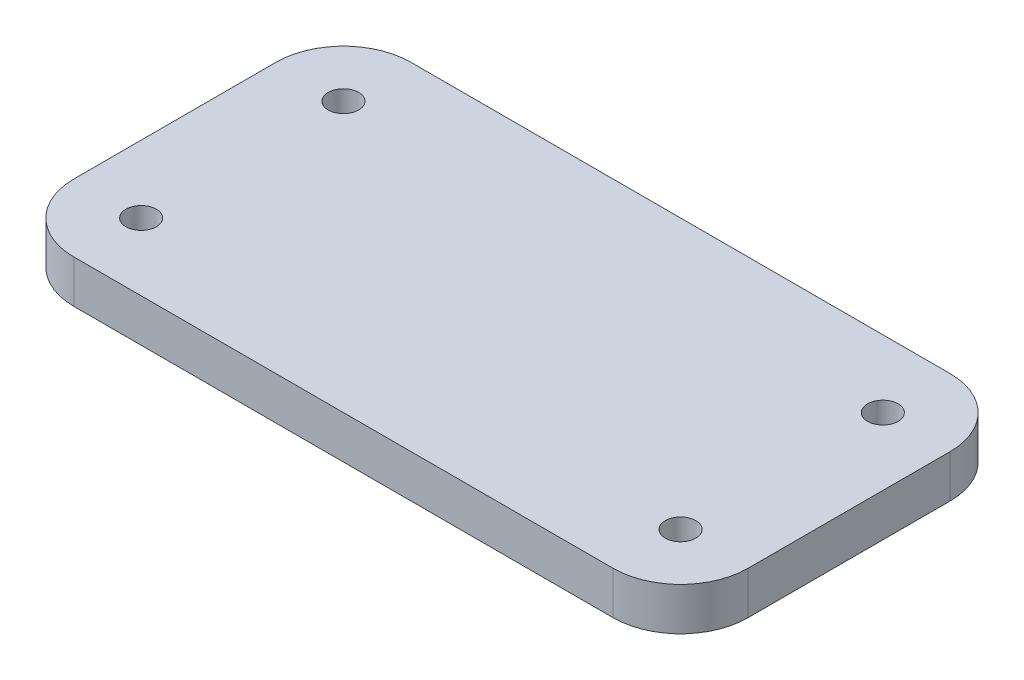
ISO-10303-21;
HEADER;
FILE_DESCRIPTION(('STEP AP214'),'2;1');
FILE_NAME('part.step','',(''),(''),'','','');
FILE_SCHEMA(('AUTOMOTIVE_DESIGN { 1 0 10303 214 1 1 1 1 }'));
ENDSEC;
DATA;
#1=APPLICATION_CONTEXT('core data for automotive mechanical design processes');
#2=APPLICATION_PROTOCOL_DEFINITION('international standard','automotive_design',2000,#1);
#3=PRODUCT_CONTEXT('',#1,'mechanical');
#4=PRODUCT('Part','Part','',(#3));
#5=PRODUCT_RELATED_PRODUCT_CATEGORY('part','',(#4));
#6=PRODUCT_DEFINITION_FORMATION('','',#4);
#7=PRODUCT_DEFINITION_CONTEXT('part definition',#1,'design');
#8=PRODUCT_DEFINITION('design','',#6,#7);
#9=PRODUCT_DEFINITION_SHAPE('','',#8);
#10=(LENGTH_UNIT() NAMED_UNIT(*) SI_UNIT(.MILLI.,.METRE.));
#11=(NAMED_UNIT(*) PLANE_ANGLE_UNIT() SI_UNIT($,.RADIAN.));
#12=(NAMED_UNIT(*) SI_UNIT($,.STERADIAN.) SOLID_ANGLE_UNIT());
#13=UNCERTAINTY_MEASURE_WITH_UNIT(LENGTH_MEASURE(1.E-05),#10,'distance_accuracy_value','');
#14=(GEOMETRIC_REPRESENTATION_CONTEXT(3) GLOBAL_UNCERTAINTY_ASSIGNED_CONTEXT((#13)) GLOBAL_UNIT_ASSIGNED_CONTEXT((#10,
#11,#12)) REPRESENTATION_CONTEXT('',''));
#15=CARTESIAN_POINT('',(0.,0.,0.));
#16=DIRECTION('',(0.,0.,1.));
#17=DIRECTION('',(1.,0.,0.));
#18=AXIS2_PLACEMENT_3D('',#15,#16,#17);
#19=CARTESIAN_POINT('',(0.,3.175,0.));
#20=DIRECTION('',(0.,1.,0.));
#21=DIRECTION('',(0.,0.,1.));
#22=AXIS2_PLACEMENT_3D('',#19,#20,#21);
#23=PLANE('',#22);
#24=CARTESIAN_POINT('',(5.,3.175,5.));
#25=DIRECTION('',(0.,1.,0.));
#26=DIRECTION('',(0.,0.,1.));
#27=AXIS2_PLACEMENT_3D('',#24,#25,#26);
#28=CIRCLE('',#27,1.1303);
#29=CARTESIAN_POINT('',(5.,3.175,6.1303));
#30=VERTEX_POINT('',#29);
#31=EDGE_CURVE('E241',#30,#30,#28,.T.);
#32=ORIENTED_EDGE('',*,*,#31,.F.);
#33=EDGE_LOOP('',(#32));
#34=FACE_BOUND('',#33,.T.);
#35=CARTESIAN_POINT('',(45.,3.175,5.));
#36=DIRECTION('',(0.,1.,0.));
#37=DIRECTION('',(0.,0.,1.));
#38=AXIS2_PLACEMENT_3D('',#35,#36,#37);
#39=CIRCLE('',#38,1.1303);
#40=CARTESIAN_POINT('',(45.,3.175,6.1303));
#41=VERTEX_POINT('',#40);
#42=EDGE_CURVE('E233',#41,#41,#39,.T.);
#43=ORIENTED_EDGE('',*,*,#42,.F.);
#44=EDGE_LOOP('',(#43));
#45=FACE_BOUND('',#44,.T.);
#46=CARTESIAN_POINT('',(45.,3.175,20.));
#47=DIRECTION('',(0.,1.,0.));
#48=DIRECTION('',(0.,0.,1.));
#49=AXIS2_PLACEMENT_3D('',#46,#47,#48);
#50=CIRCLE('',#49,1.1303);
#51=CARTESIAN_POINT('',(45.,3.175,21.1303));
#52=VERTEX_POINT('',#51);
#53=EDGE_CURVE('E225',#52,#52,#50,.T.);
#54=ORIENTED_EDGE('',*,*,#53,.F.);
#55=EDGE_LOOP('',(#54));
#56=FACE_BOUND('',#55,.T.);
#57=CARTESIAN_POINT('',(5.00000000000001,3.175,20.));
#58=DIRECTION('',(0.,-1.,0.));
#59=DIRECTION('',(0.,0.,-1.));
#60=AXIS2_PLACEMENT_3D('',#57,#58,#59);
#61=CIRCLE('',#60,1.1303);
#62=CARTESIAN_POINT('',(5.00000000000001,3.175,18.8697));
#63=VERTEX_POINT('',#62);
#64=EDGE_CURVE('E144',#63,#63,#61,.T.);
#65=ORIENTED_EDGE('',*,*,#64,.T.);
#66=EDGE_LOOP('',(#65));
#67=FACE_BOUND('',#66,.T.);
#68=DIRECTION('',(-1.,0.,0.));
#69=VECTOR('',#68,1.);
#70=CARTESIAN_POINT('',(0.,3.175,0.));
#71=LINE('',#70,#69);
#72=CARTESIAN_POINT('',(45.,3.175,0.));
#73=VERTEX_POINT('',#72);
#74=CARTESIAN_POINT('',(5.,3.175,0.));
#75=VERTEX_POINT('',#74);
#76=EDGE_CURVE('E155',#73,#75,#71,.T.);
#77=ORIENTED_EDGE('',*,*,#76,.T.);
#78=CARTESIAN_POINT('',(5.,3.175,5.));
#79=DIRECTION('',(0.,1.,0.));
#80=DIRECTION('',(0.,0.,1.));
#81=AXIS2_PLACEMENT_3D('',#78,#79,#80);
#82=CIRCLE('',#81,5.);
#83=CARTESIAN_POINT('',(0.,3.175,5.));
#84=VERTEX_POINT('',#83);
#85=EDGE_CURVE('E185',#75,#84,#82,.T.);
#86=ORIENTED_EDGE('',*,*,#85,.T.);
#87=DIRECTION('',(0.,0.,1.));
#88=VECTOR('',#87,1.);
#89=CARTESIAN_POINT('',(0.,3.175,0.));
#90=LINE('',#89,#88);
#91=CARTESIAN_POINT('',(0.,3.175,20.));
#92=VERTEX_POINT('',#91);
#93=EDGE_CURVE('E135',#84,#92,#90,.T.);
#94=ORIENTED_EDGE('',*,*,#93,.T.);
#95=CARTESIAN_POINT('',(4.99999999999999,3.175,20.));
#96=DIRECTION('',(0.,1.,0.));
#97=DIRECTION('',(0.,0.,1.));
#98=AXIS2_PLACEMENT_3D('',#95,#96,#97);
#99=CIRCLE('',#98,5.);
#100=CARTESIAN_POINT('',(4.99999999999999,3.175,25.));
#101=VERTEX_POINT('',#100);
#102=EDGE_CURVE('E177',#92,#101,#99,.T.);
#103=ORIENTED_EDGE('',*,*,#102,.T.);
#104=DIRECTION('',(1.,0.,0.));
#105=VECTOR('',#104,1.);
#106=CARTESIAN_POINT('',(0.,3.175,25.));
#107=LINE('',#106,#105);
#108=CARTESIAN_POINT('',(45.,3.175,25.));
#109=VERTEX_POINT('',#108);
#110=EDGE_CURVE('E200',#101,#109,#107,.T.);
#111=ORIENTED_EDGE('',*,*,#110,.T.);
#112=CARTESIAN_POINT('',(45.,3.175,20.));
#113=DIRECTION('',(0.,1.,0.));
#114=DIRECTION('',(0.,0.,1.));
#115=AXIS2_PLACEMENT_3D('',#112,#113,#114);
#116=CIRCLE('',#115,5.);
#117=CARTESIAN_POINT('',(50.,3.175,20.));
#118=VERTEX_POINT('',#117);
#119=EDGE_CURVE('E70',#109,#118,#116,.T.);
#120=ORIENTED_EDGE('',*,*,#119,.T.);
#121=DIRECTION('',(0.,0.,-1.));
#122=VECTOR('',#121,1.);
#123=CARTESIAN_POINT('',(50.,3.175,0.));
#124=LINE('',#123,#122);
#125=CARTESIAN_POINT('',(50.,3.175,5.));
#126=VERTEX_POINT('',#125);
#127=EDGE_CURVE('E208',#118,#126,#124,.T.);
#128=ORIENTED_EDGE('',*,*,#127,.T.);
#129=CARTESIAN_POINT('',(45.,3.175,5.));
#130=DIRECTION('',(0.,1.,0.));
#131=DIRECTION('',(0.,0.,1.));
#132=AXIS2_PLACEMENT_3D('',#129,#130,#131);
#133=CIRCLE('',#132,5.);
#134=EDGE_CURVE('E182',#126,#73,#133,.T.);
#135=ORIENTED_EDGE('',*,*,#134,.T.);
#136=EDGE_LOOP('',(#77,#86,#94,#103,#111,#120,#128,#135));
#137=FACE_BOUND('',#136,.T.);
#138=ADVANCED_FACE('F47',(#34,#45,#56,#67,#137),#23,.T.);
#139=CARTESIAN_POINT('',(0.,0.,0.));
#140=DIRECTION('',(0.,1.,0.));
#141=DIRECTION('',(0.,0.,1.));
#142=AXIS2_PLACEMENT_3D('',#139,#140,#141);
#143=PLANE('',#142);
#144=CARTESIAN_POINT('',(5.,0.,5.));
#145=DIRECTION('',(0.,1.,0.));
#146=DIRECTION('',(0.,0.,1.));
#147=AXIS2_PLACEMENT_3D('',#144,#145,#146);
#148=CIRCLE('',#147,1.1303);
#149=CARTESIAN_POINT('',(5.,0.,6.1303));
#150=VERTEX_POINT('',#149);
#151=EDGE_CURVE('E237',#150,#150,#148,.T.);
#152=ORIENTED_EDGE('',*,*,#151,.T.);
#153=EDGE_LOOP('',(#152));
#154=FACE_BOUND('',#153,.T.);
#155=CARTESIAN_POINT('',(45.,0.,5.));
#156=DIRECTION('',(0.,1.,0.));
#157=DIRECTION('',(0.,0.,1.));
#158=AXIS2_PLACEMENT_3D('',#155,#156,#157);
#159=CIRCLE('',#158,1.1303);
#160=CARTESIAN_POINT('',(45.,0.,6.1303));
#161=VERTEX_POINT('',#160);
#162=EDGE_CURVE('E229',#161,#161,#159,.T.);
#163=ORIENTED_EDGE('',*,*,#162,.T.);
#164=EDGE_LOOP('',(#163));
#165=FACE_BOUND('',#164,.T.);
#166=CARTESIAN_POINT('',(45.,0.,20.));
#167=DIRECTION('',(0.,1.,0.));
#168=DIRECTION('',(0.,0.,1.));
#169=AXIS2_PLACEMENT_3D('',#166,#167,#168);
#170=CIRCLE('',#169,1.1303);
#171=CARTESIAN_POINT('',(45.,0.,21.1303));
#172=VERTEX_POINT('',#171);
#173=EDGE_CURVE('E221',#172,#172,#170,.T.);
#174=ORIENTED_EDGE('',*,*,#173,.T.);
#175=EDGE_LOOP('',(#174));
#176=FACE_BOUND('',#175,.T.);
#177=CARTESIAN_POINT('',(5.00000000000001,0.,20.));
#178=DIRECTION('',(0.,-1.,0.));
#179=DIRECTION('',(0.,0.,-1.));
#180=AXIS2_PLACEMENT_3D('',#177,#178,#179);
#181=CIRCLE('',#180,1.1303);
#182=CARTESIAN_POINT('',(5.00000000000001,0.,18.8697));
#183=VERTEX_POINT('',#182);
#184=EDGE_CURVE('E152',#183,#183,#181,.T.);
#185=ORIENTED_EDGE('',*,*,#184,.F.);
#186=EDGE_LOOP('',(#185));
#187=FACE_BOUND('',#186,.T.);
#188=DIRECTION('',(0.,0.,1.));
#189=VECTOR('',#188,1.);
#190=CARTESIAN_POINT('',(0.,0.,0.));
#191=LINE('',#190,#189);
#192=CARTESIAN_POINT('',(0.,0.,5.));
#193=VERTEX_POINT('',#192);
#194=CARTESIAN_POINT('',(0.,0.,20.));
#195=VERTEX_POINT('',#194);
#196=EDGE_CURVE('E132',#193,#195,#191,.T.);
#197=ORIENTED_EDGE('',*,*,#196,.F.);
#198=CARTESIAN_POINT('',(5.,0.,5.));
#199=DIRECTION('',(0.,1.,0.));
#200=DIRECTION('',(0.,0.,1.));
#201=AXIS2_PLACEMENT_3D('',#198,#199,#200);
#202=CIRCLE('',#201,5.);
#203=CARTESIAN_POINT('',(5.,0.,0.));
#204=VERTEX_POINT('',#203);
#205=EDGE_CURVE('E114',#193,#204,#202,.F.);
#206=ORIENTED_EDGE('',*,*,#205,.T.);
#207=DIRECTION('',(-1.,0.,0.));
#208=VECTOR('',#207,1.);
#209=CARTESIAN_POINT('',(0.,0.,0.));
#210=LINE('',#209,#208);
#211=CARTESIAN_POINT('',(45.,0.,0.));
#212=VERTEX_POINT('',#211);
#213=EDGE_CURVE('E160',#212,#204,#210,.T.);
#214=ORIENTED_EDGE('',*,*,#213,.F.);
#215=CARTESIAN_POINT('',(45.,0.,5.));
#216=DIRECTION('',(0.,1.,0.));
#217=DIRECTION('',(0.,0.,1.));
#218=AXIS2_PLACEMENT_3D('',#215,#216,#217);
#219=CIRCLE('',#218,5.);
#220=CARTESIAN_POINT('',(50.,0.,5.));
#221=VERTEX_POINT('',#220);
#222=EDGE_CURVE('E126',#212,#221,#219,.F.);
#223=ORIENTED_EDGE('',*,*,#222,.T.);
#224=DIRECTION('',(0.,0.,-1.));
#225=VECTOR('',#224,1.);
#226=CARTESIAN_POINT('',(50.,0.,0.));
#227=LINE('',#226,#225);
#228=CARTESIAN_POINT('',(50.,0.,20.));
#229=VERTEX_POINT('',#228);
#230=EDGE_CURVE('E149',#229,#221,#227,.T.);
#231=ORIENTED_EDGE('',*,*,#230,.F.);
#232=CARTESIAN_POINT('',(45.,0.,20.));
#233=DIRECTION('',(0.,1.,0.));
#234=DIRECTION('',(0.,0.,1.));
#235=AXIS2_PLACEMENT_3D('',#232,#233,#234);
#236=CIRCLE('',#235,5.);
#237=CARTESIAN_POINT('',(45.,0.,25.));
#238=VERTEX_POINT('',#237);
#239=EDGE_CURVE('E167',#229,#238,#236,.F.);
#240=ORIENTED_EDGE('',*,*,#239,.T.);
#241=DIRECTION('',(1.,0.,0.));
#242=VECTOR('',#241,1.);
#243=CARTESIAN_POINT('',(0.,0.,25.));
#244=LINE('',#243,#242);
#245=CARTESIAN_POINT('',(4.99999999999999,0.,25.));
#246=VERTEX_POINT('',#245);
#247=EDGE_CURVE('E143',#246,#238,#244,.T.);
#248=ORIENTED_EDGE('',*,*,#247,.F.);
#249=CARTESIAN_POINT('',(4.99999999999999,0.,20.));
#250=DIRECTION('',(0.,1.,0.));
#251=DIRECTION('',(0.,0.,1.));
#252=AXIS2_PLACEMENT_3D('',#249,#250,#251);
#253=CIRCLE('',#252,5.);
#254=EDGE_CURVE('E137',#246,#195,#253,.F.);
#255=ORIENTED_EDGE('',*,*,#254,.T.);
#256=EDGE_LOOP('',(#197,#206,#214,#223,#231,#240,#248,#255));
#257=FACE_BOUND('',#256,.T.);
#258=ADVANCED_FACE('F140',(#154,#165,#176,#187,#257),#143,.F.);
#259=CARTESIAN_POINT('',(0.,3.175,0.));
#260=DIRECTION('',(1.,0.,0.));
#261=DIRECTION('',(0.,0.,-1.));
#262=AXIS2_PLACEMENT_3D('',#259,#260,#261);
#263=PLANE('',#262);
#264=ORIENTED_EDGE('',*,*,#93,.F.);
#265=DIRECTION('',(0.,-1.,0.));
#266=VECTOR('',#265,1.);
#267=CARTESIAN_POINT('',(0.,3.175,5.));
#268=LINE('',#267,#266);
#269=EDGE_CURVE('E118',#84,#193,#268,.T.);
#270=ORIENTED_EDGE('',*,*,#269,.T.);
#271=ORIENTED_EDGE('',*,*,#196,.T.);
#272=DIRECTION('',(0.,-1.,0.));
#273=VECTOR('',#272,1.);
#274=CARTESIAN_POINT('',(0.,3.175,20.));
#275=LINE('',#274,#273);
#276=EDGE_CURVE('E138',#195,#92,#275,.F.);
#277=ORIENTED_EDGE('',*,*,#276,.T.);
#278=EDGE_LOOP('',(#264,#270,#271,#277));
#279=FACE_BOUND('',#278,.T.);
#280=ADVANCED_FACE('F131',(#279),#263,.F.);
#281=CARTESIAN_POINT('',(0.,3.175,25.));
#282=DIRECTION('',(0.,0.,-1.));
#283=DIRECTION('',(-1.,0.,0.));
#284=AXIS2_PLACEMENT_3D('',#281,#282,#283);
#285=PLANE('',#284);
#286=ORIENTED_EDGE('',*,*,#247,.T.);
#287=DIRECTION('',(0.,-1.,0.));
#288=VECTOR('',#287,1.);
#289=CARTESIAN_POINT('',(45.,3.175,25.));
#290=LINE('',#289,#288);
#291=EDGE_CURVE('E11',#238,#109,#290,.F.);
#292=ORIENTED_EDGE('',*,*,#291,.T.);
#293=ORIENTED_EDGE('',*,*,#110,.F.);
#294=DIRECTION('',(0.,-1.,0.));
#295=VECTOR('',#294,1.);
#296=CARTESIAN_POINT('',(4.99999999999999,3.175,25.));
#297=LINE('',#296,#295);
#298=EDGE_CURVE('E56',#101,#246,#297,.T.);
#299=ORIENTED_EDGE('',*,*,#298,.T.);
#300=EDGE_LOOP('',(#286,#292,#293,#299));
#301=FACE_BOUND('',#300,.T.);
#302=ADVANCED_FACE('F198',(#301),#285,.F.);
#303=CARTESIAN_POINT('',(50.,3.175,0.));
#304=DIRECTION('',(-1.,0.,0.));
#305=DIRECTION('',(0.,0.,1.));
#306=AXIS2_PLACEMENT_3D('',#303,#304,#305);
#307=PLANE('',#306);
#308=ORIENTED_EDGE('',*,*,#230,.T.);
#309=DIRECTION('',(0.,-1.,0.));
#310=VECTOR('',#309,1.);
#311=CARTESIAN_POINT('',(50.,3.175,5.));
#312=LINE('',#311,#310);
#313=EDGE_CURVE('E63',#221,#126,#312,.F.);
#314=ORIENTED_EDGE('',*,*,#313,.T.);
#315=ORIENTED_EDGE('',*,*,#127,.F.);
#316=DIRECTION('',(0.,-1.,0.));
#317=VECTOR('',#316,1.);
#318=CARTESIAN_POINT('',(50.,3.175,20.));
#319=LINE('',#318,#317);
#320=EDGE_CURVE('E188',#118,#229,#319,.T.);
#321=ORIENTED_EDGE('',*,*,#320,.T.);
#322=EDGE_LOOP('',(#308,#314,#315,#321));
#323=FACE_BOUND('',#322,.T.);
#324=ADVANCED_FACE('F207',(#323),#307,.F.);
#325=CARTESIAN_POINT('',(0.,3.175,0.));
#326=DIRECTION('',(0.,0.,1.));
#327=DIRECTION('',(1.,0.,0.));
#328=AXIS2_PLACEMENT_3D('',#325,#326,#327);
#329=PLANE('',#328);
#330=ORIENTED_EDGE('',*,*,#213,.T.);
#331=DIRECTION('',(0.,-1.,0.));
#332=VECTOR('',#331,1.);
#333=CARTESIAN_POINT('',(5.,3.175,0.));
#334=LINE('',#333,#332);
#335=EDGE_CURVE('E119',#204,#75,#334,.F.);
#336=ORIENTED_EDGE('',*,*,#335,.T.);
#337=ORIENTED_EDGE('',*,*,#76,.F.);
#338=DIRECTION('',(0.,-1.,0.));
#339=VECTOR('',#338,1.);
#340=CARTESIAN_POINT('',(45.,3.175,0.));
#341=LINE('',#340,#339);
#342=EDGE_CURVE('E125',#73,#212,#341,.T.);
#343=ORIENTED_EDGE('',*,*,#342,.T.);
#344=EDGE_LOOP('',(#330,#336,#337,#343));
#345=FACE_BOUND('',#344,.T.);
#346=ADVANCED_FACE('F259',(#345),#329,.F.);
#347=CARTESIAN_POINT('',(5.,3.175,5.));
#348=DIRECTION('',(0.,-1.,0.));
#349=DIRECTION('',(0.,0.,-1.));
#350=AXIS2_PLACEMENT_3D('',#347,#348,#349);
#351=CYLINDRICAL_SURFACE('',#350,5.);
#352=ORIENTED_EDGE('',*,*,#85,.F.);
#353=ORIENTED_EDGE('',*,*,#335,.F.);
#354=ORIENTED_EDGE('',*,*,#205,.F.);
#355=ORIENTED_EDGE('',*,*,#269,.F.);
#356=EDGE_LOOP('',(#352,#353,#354,#355));
#357=FACE_BOUND('',#356,.T.);
#358=ADVANCED_FACE('F117',(#357),#351,.T.);
#359=CARTESIAN_POINT('',(45.,3.175,5.));
#360=DIRECTION('',(0.,-1.,0.));
#361=DIRECTION('',(0.,0.,-1.));
#362=AXIS2_PLACEMENT_3D('',#359,#360,#361);
#363=CYLINDRICAL_SURFACE('',#362,5.);
#364=ORIENTED_EDGE('',*,*,#134,.F.);
#365=ORIENTED_EDGE('',*,*,#313,.F.);
#366=ORIENTED_EDGE('',*,*,#222,.F.);
#367=ORIENTED_EDGE('',*,*,#342,.F.);
#368=EDGE_LOOP('',(#364,#365,#366,#367));
#369=FACE_BOUND('',#368,.T.);
#370=ADVANCED_FACE('F261',(#369),#363,.T.);
#371=CARTESIAN_POINT('',(45.,3.175,20.));
#372=DIRECTION('',(0.,-1.,0.));
#373=DIRECTION('',(0.,0.,-1.));
#374=AXIS2_PLACEMENT_3D('',#371,#372,#373);
#375=CYLINDRICAL_SURFACE('',#374,5.);
#376=ORIENTED_EDGE('',*,*,#119,.F.);
#377=ORIENTED_EDGE('',*,*,#291,.F.);
#378=ORIENTED_EDGE('',*,*,#239,.F.);
#379=ORIENTED_EDGE('',*,*,#320,.F.);
#380=EDGE_LOOP('',(#376,#377,#378,#379));
#381=FACE_BOUND('',#380,.T.);
#382=ADVANCED_FACE('F206',(#381),#375,.T.);
#383=CARTESIAN_POINT('',(4.99999999999999,3.175,20.));
#384=DIRECTION('',(0.,-1.,0.));
#385=DIRECTION('',(0.,0.,-1.));
#386=AXIS2_PLACEMENT_3D('',#383,#384,#385);
#387=CYLINDRICAL_SURFACE('',#386,5.);
#388=ORIENTED_EDGE('',*,*,#102,.F.);
#389=ORIENTED_EDGE('',*,*,#276,.F.);
#390=ORIENTED_EDGE('',*,*,#254,.F.);
#391=ORIENTED_EDGE('',*,*,#298,.F.);
#392=EDGE_LOOP('',(#388,#389,#390,#391));
#393=FACE_BOUND('',#392,.T.);
#394=ADVANCED_FACE('F49',(#393),#387,.T.);
#395=CARTESIAN_POINT('',(5.00000000000001,0.,20.));
#396=DIRECTION('',(0.,-1.,0.));
#397=DIRECTION('',(0.,0.,-1.));
#398=AXIS2_PLACEMENT_3D('',#395,#396,#397);
#399=CYLINDRICAL_SURFACE('',#398,1.1303);
#400=ORIENTED_EDGE('',*,*,#64,.F.);
#401=EDGE_LOOP('',(#400));
#402=FACE_BOUND('',#401,.T.);
#403=ORIENTED_EDGE('',*,*,#184,.T.);
#404=EDGE_LOOP('',(#403));
#405=FACE_BOUND('',#404,.T.);
#406=ADVANCED_FACE('F281',(#402,#405),#399,.F.);
#407=CARTESIAN_POINT('',(45.,3.175,20.));
#408=DIRECTION('',(0.,1.,0.));
#409=DIRECTION('',(0.,0.,1.));
#410=AXIS2_PLACEMENT_3D('',#407,#408,#409);
#411=CYLINDRICAL_SURFACE('',#410,1.1303);
#412=ORIENTED_EDGE('',*,*,#173,.F.);
#413=EDGE_LOOP('',(#412));
#414=FACE_BOUND('',#413,.T.);
#415=ORIENTED_EDGE('',*,*,#53,.T.);
#416=EDGE_LOOP('',(#415));
#417=FACE_BOUND('',#416,.T.);
#418=ADVANCED_FACE('F284',(#414,#417),#411,.F.);
#419=CARTESIAN_POINT('',(45.,3.175,5.));
#420=DIRECTION('',(0.,1.,0.));
#421=DIRECTION('',(0.,0.,1.));
#422=AXIS2_PLACEMENT_3D('',#419,#420,#421);
#423=CYLINDRICAL_SURFACE('',#422,1.1303);
#424=ORIENTED_EDGE('',*,*,#162,.F.);
#425=EDGE_LOOP('',(#424));
#426=FACE_BOUND('',#425,.T.);
#427=ORIENTED_EDGE('',*,*,#42,.T.);
#428=EDGE_LOOP('',(#427));
#429=FACE_BOUND('',#428,.T.);
#430=ADVANCED_FACE('F288',(#426,#429),#423,.F.);
#431=CARTESIAN_POINT('',(5.,3.175,5.));
#432=DIRECTION('',(0.,1.,0.));
#433=DIRECTION('',(0.,0.,1.));
#434=AXIS2_PLACEMENT_3D('',#431,#432,#433);
#435=CYLINDRICAL_SURFACE('',#434,1.1303);
#436=ORIENTED_EDGE('',*,*,#151,.F.);
#437=EDGE_LOOP('',(#436));
#438=FACE_BOUND('',#437,.T.);
#439=ORIENTED_EDGE('',*,*,#31,.T.);
#440=EDGE_LOOP('',(#439));
#441=FACE_BOUND('',#440,.T.);
#442=ADVANCED_FACE('F246',(#438,#441),#435,.F.);
#443=CLOSED_SHELL('',(#138,#258,#280,#302,#324,#346,#358,#370,#382,#394,#406,#418,#430,#442));
#444=MANIFOLD_SOLID_BREP('B2',#443);
#445=ADVANCED_BREP_SHAPE_REPRESENTATION('',(#18,#444),#14);
#446=SHAPE_DEFINITION_REPRESENTATION(#9,#445);
ENDSEC;
END-ISO-10303-21;
